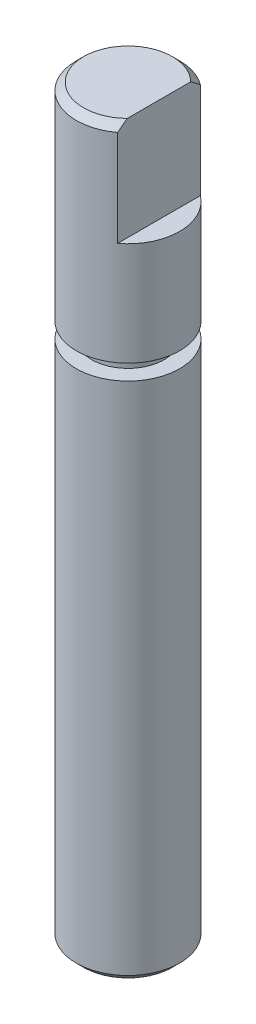
ISO-10303-21;
HEADER;
FILE_DESCRIPTION(('STEP AP214'),'2;1');
FILE_NAME('part.step','',(''),(''),'','','');
FILE_SCHEMA(('AUTOMOTIVE_DESIGN { 1 0 10303 214 1 1 1 1 }'));
ENDSEC;
DATA;
#1=APPLICATION_CONTEXT('core data for automotive mechanical design processes');
#2=APPLICATION_PROTOCOL_DEFINITION('international standard','automotive_design',2000,#1);
#3=PRODUCT_CONTEXT('',#1,'mechanical');
#4=PRODUCT('Part','Part','',(#3));
#5=PRODUCT_RELATED_PRODUCT_CATEGORY('part','',(#4));
#6=PRODUCT_DEFINITION_FORMATION('','',#4);
#7=PRODUCT_DEFINITION_CONTEXT('part definition',#1,'design');
#8=PRODUCT_DEFINITION('design','',#6,#7);
#9=PRODUCT_DEFINITION_SHAPE('','',#8);
#10=(LENGTH_UNIT() NAMED_UNIT(*) SI_UNIT(.MILLI.,.METRE.));
#11=(NAMED_UNIT(*) PLANE_ANGLE_UNIT() SI_UNIT($,.RADIAN.));
#12=(NAMED_UNIT(*) SI_UNIT($,.STERADIAN.) SOLID_ANGLE_UNIT());
#13=UNCERTAINTY_MEASURE_WITH_UNIT(LENGTH_MEASURE(1.E-05),#10,'distance_accuracy_value','');
#14=(GEOMETRIC_REPRESENTATION_CONTEXT(3) GLOBAL_UNCERTAINTY_ASSIGNED_CONTEXT((#13)) GLOBAL_UNIT_ASSIGNED_CONTEXT((#10,
#11,#12)) REPRESENTATION_CONTEXT('',''));
#15=CARTESIAN_POINT('',(0.,0.,0.));
#16=DIRECTION('',(0.,0.,1.));
#17=DIRECTION('',(1.,0.,0.));
#18=AXIS2_PLACEMENT_3D('',#15,#16,#17);
#19=CARTESIAN_POINT('',(0.,0.,0.));
#20=DIRECTION('',(0.,-1.,0.));
#21=DIRECTION('',(1.,0.,0.));
#22=AXIS2_PLACEMENT_3D('',#19,#20,#21);
#23=PLANE('',#22);
#24=CARTESIAN_POINT('',(0.,0.,0.));
#25=DIRECTION('',(0.,1.,0.));
#26=DIRECTION('',(-1.,0.,0.));
#27=AXIS2_PLACEMENT_3D('',#24,#25,#26);
#28=CIRCLE('',#27,4.29289321881344);
#29=CARTESIAN_POINT('',(-4.29289321881344,0.,0.));
#30=VERTEX_POINT('',#29);
#31=EDGE_CURVE('E106',#30,#30,#28,.T.);
#32=ORIENTED_EDGE('',*,*,#31,.F.);
#33=EDGE_LOOP('',(#32));
#34=FACE_BOUND('',#33,.T.);
#35=ADVANCED_FACE('F33',(#34),#23,.T.);
#36=CARTESIAN_POINT('',(0.,0.707106781186545,0.));
#37=DIRECTION('',(0.,1.,0.));
#38=DIRECTION('',(-1.,0.,0.));
#39=AXIS2_PLACEMENT_3D('',#36,#37,#38);
#40=CONICAL_SURFACE('',#39,4.99999999999999,0.785398163397451);
#41=ORIENTED_EDGE('',*,*,#31,.T.);
#42=EDGE_LOOP('',(#41));
#43=FACE_BOUND('',#42,.T.);
#44=CARTESIAN_POINT('',(0.,0.707106781186545,0.));
#45=DIRECTION('',(0.,1.,0.));
#46=DIRECTION('',(-1.,0.,0.));
#47=AXIS2_PLACEMENT_3D('',#44,#45,#46);
#48=CIRCLE('',#47,4.99999999999999);
#49=CARTESIAN_POINT('',(-4.99999999999999,0.707106781186545,0.));
#50=VERTEX_POINT('',#49);
#51=EDGE_CURVE('E103',#50,#50,#48,.T.);
#52=ORIENTED_EDGE('',*,*,#51,.F.);
#53=EDGE_LOOP('',(#52));
#54=FACE_BOUND('',#53,.T.);
#55=ADVANCED_FACE('F123',(#43,#54),#40,.T.);
#56=CARTESIAN_POINT('',(0.,72.,0.));
#57=DIRECTION('',(0.,1.,0.));
#58=DIRECTION('',(-1.,0.,0.));
#59=AXIS2_PLACEMENT_3D('',#56,#57,#58);
#60=CYLINDRICAL_SURFACE('',#59,4.99999999999999);
#61=ORIENTED_EDGE('',*,*,#51,.T.);
#62=EDGE_LOOP('',(#61));
#63=FACE_BOUND('',#62,.T.);
#64=CARTESIAN_POINT('',(0.,50.5,0.));
#65=DIRECTION('',(0.,1.,0.));
#66=DIRECTION('',(-1.,0.,0.));
#67=AXIS2_PLACEMENT_3D('',#64,#65,#66);
#68=CIRCLE('',#67,4.99999999999999);
#69=CARTESIAN_POINT('',(-4.99999999999999,50.5,0.));
#70=VERTEX_POINT('',#69);
#71=EDGE_CURVE('E100',#70,#70,#68,.T.);
#72=ORIENTED_EDGE('',*,*,#71,.F.);
#73=EDGE_LOOP('',(#72));
#74=FACE_BOUND('',#73,.T.);
#75=ADVANCED_FACE('F128',(#63,#74),#60,.T.);
#76=CARTESIAN_POINT('',(-4.99999999999999,50.5,0.));
#77=DIRECTION('',(0.,1.,0.));
#78=DIRECTION('',(-1.,0.,0.));
#79=AXIS2_PLACEMENT_3D('',#76,#77,#78);
#80=PLANE('',#79);
#81=ORIENTED_EDGE('',*,*,#71,.T.);
#82=EDGE_LOOP('',(#81));
#83=FACE_BOUND('',#82,.T.);
#84=CARTESIAN_POINT('',(0.,50.5,0.));
#85=DIRECTION('',(0.,1.,0.));
#86=DIRECTION('',(-1.,0.,0.));
#87=AXIS2_PLACEMENT_3D('',#84,#85,#86);
#88=CIRCLE('',#87,3.5);
#89=CARTESIAN_POINT('',(-3.5,50.5,0.));
#90=VERTEX_POINT('',#89);
#91=EDGE_CURVE('E97',#90,#90,#88,.T.);
#92=ORIENTED_EDGE('',*,*,#91,.F.);
#93=EDGE_LOOP('',(#92));
#94=FACE_BOUND('',#93,.T.);
#95=ADVANCED_FACE('F136',(#83,#94),#80,.T.);
#96=CARTESIAN_POINT('',(0.,72.,0.));
#97=DIRECTION('',(0.,1.,0.));
#98=DIRECTION('',(-1.,0.,0.));
#99=AXIS2_PLACEMENT_3D('',#96,#97,#98);
#100=CYLINDRICAL_SURFACE('',#99,3.5);
#101=ORIENTED_EDGE('',*,*,#91,.T.);
#102=EDGE_LOOP('',(#101));
#103=FACE_BOUND('',#102,.T.);
#104=CARTESIAN_POINT('',(0.,52.,0.));
#105=DIRECTION('',(0.,1.,0.));
#106=DIRECTION('',(-1.,0.,0.));
#107=AXIS2_PLACEMENT_3D('',#104,#105,#106);
#108=CIRCLE('',#107,3.5);
#109=CARTESIAN_POINT('',(-3.5,52.,0.));
#110=VERTEX_POINT('',#109);
#111=EDGE_CURVE('E94',#110,#110,#108,.T.);
#112=ORIENTED_EDGE('',*,*,#111,.F.);
#113=EDGE_LOOP('',(#112));
#114=FACE_BOUND('',#113,.T.);
#115=ADVANCED_FACE('F142',(#103,#114),#100,.T.);
#116=CARTESIAN_POINT('',(-3.5,52.,0.));
#117=DIRECTION('',(0.,-1.,0.));
#118=DIRECTION('',(1.,0.,0.));
#119=AXIS2_PLACEMENT_3D('',#116,#117,#118);
#120=PLANE('',#119);
#121=ORIENTED_EDGE('',*,*,#111,.T.);
#122=EDGE_LOOP('',(#121));
#123=FACE_BOUND('',#122,.T.);
#124=CARTESIAN_POINT('',(0.,52.,0.));
#125=DIRECTION('',(0.,1.,0.));
#126=DIRECTION('',(-1.,0.,0.));
#127=AXIS2_PLACEMENT_3D('',#124,#125,#126);
#128=CIRCLE('',#127,5.);
#129=CARTESIAN_POINT('',(-5.,52.,0.));
#130=VERTEX_POINT('',#129);
#131=EDGE_CURVE('E91',#130,#130,#128,.T.);
#132=ORIENTED_EDGE('',*,*,#131,.F.);
#133=EDGE_LOOP('',(#132));
#134=FACE_BOUND('',#133,.T.);
#135=ADVANCED_FACE('F148',(#123,#134),#120,.T.);
#136=CARTESIAN_POINT('',(0.,72.,0.));
#137=DIRECTION('',(0.,1.,0.));
#138=DIRECTION('',(-1.,0.,0.));
#139=AXIS2_PLACEMENT_3D('',#136,#137,#138);
#140=CYLINDRICAL_SURFACE('',#139,5.);
#141=DIRECTION('',(0.,1.,0.));
#142=VECTOR('',#141,1.);
#143=CARTESIAN_POINT('',(3.,72.,4.));
#144=LINE('',#143,#142);
#145=CARTESIAN_POINT('',(3.,71.2928932188134,4.));
#146=VERTEX_POINT('',#145);
#147=CARTESIAN_POINT('',(3.,62.,4.));
#148=VERTEX_POINT('',#147);
#149=EDGE_CURVE('E70',#146,#148,#144,.F.);
#150=ORIENTED_EDGE('',*,*,#149,.F.);
#151=CARTESIAN_POINT('',(0.,71.2928932188134,0.));
#152=DIRECTION('',(0.,1.,0.));
#153=DIRECTION('',(-1.,0.,0.));
#154=AXIS2_PLACEMENT_3D('',#151,#152,#153);
#155=CIRCLE('',#154,5.);
#156=CARTESIAN_POINT('',(3.,71.2928932188133,-4.00000000000048));
#157=VERTEX_POINT('',#156);
#158=EDGE_CURVE('E77',#157,#146,#155,.T.);
#159=ORIENTED_EDGE('',*,*,#158,.F.);
#160=DIRECTION('',(0.,1.,0.));
#161=VECTOR('',#160,1.);
#162=CARTESIAN_POINT('',(3.,72.,-4.));
#163=LINE('',#162,#161);
#164=CARTESIAN_POINT('',(3.,62.,-4.));
#165=VERTEX_POINT('',#164);
#166=EDGE_CURVE('E52',#165,#157,#163,.T.);
#167=ORIENTED_EDGE('',*,*,#166,.F.);
#168=CARTESIAN_POINT('',(0.,62.,0.));
#169=DIRECTION('',(0.,-1.,0.));
#170=DIRECTION('',(0.,0.,-1.));
#171=AXIS2_PLACEMENT_3D('',#168,#169,#170);
#172=CIRCLE('',#171,5.);
#173=EDGE_CURVE('E11',#148,#165,#172,.F.);
#174=ORIENTED_EDGE('',*,*,#173,.F.);
#175=EDGE_LOOP('',(#150,#159,#167,#174));
#176=FACE_BOUND('',#175,.T.);
#177=ORIENTED_EDGE('',*,*,#131,.T.);
#178=EDGE_LOOP('',(#177));
#179=FACE_BOUND('',#178,.T.);
#180=ADVANCED_FACE('F74',(#176,#179),#140,.T.);
#181=CARTESIAN_POINT('',(0.,72.,0.));
#182=DIRECTION('',(0.,-1.,0.));
#183=DIRECTION('',(1.,0.,0.));
#184=AXIS2_PLACEMENT_3D('',#181,#182,#183);
#185=CONICAL_SURFACE('',#184,4.29289321881345,0.785398163397447);
#186=CARTESIAN_POINT('',(3.,65.2777119220844,-10.5987838453196));
#187=CARTESIAN_POINT('',(3.,65.4847171292241,-10.3836363350216));
#188=CARTESIAN_POINT('',(3.,65.6914890960308,-10.16826377443));
#189=CARTESIAN_POINT('',(3.,66.104449316693,-9.73695616658823));
#190=CARTESIAN_POINT('',(3.,66.3106375652985,-9.52102111431211));
#191=CARTESIAN_POINT('',(3.,66.7223754088028,-9.08841063707692));
#192=CARTESIAN_POINT('',(3.,66.9279247776936,-8.87173499690014));
#193=CARTESIAN_POINT('',(3.,67.3381523167953,-8.43756165019662));
#194=CARTESIAN_POINT('',(3.,67.5428304902801,-8.22006394676504));
#195=CARTESIAN_POINT('',(3.,67.9496125925267,-7.78563464180021));
#196=CARTESIAN_POINT('',(3.,68.151724415531,-7.56871043736963));
#197=CARTESIAN_POINT('',(3.,68.5545824253167,-7.13359796181427));
#198=CARTESIAN_POINT('',(3.,68.7553286180107,-6.91540969617008));
#199=CARTESIAN_POINT('',(3.,69.1550205006556,-6.47744140064298));
#200=CARTESIAN_POINT('',(3.,69.3539664259327,-6.25766158576756));
#201=CARTESIAN_POINT('',(3.,69.7494963695441,-5.81598951040906));
#202=CARTESIAN_POINT('',(3.,69.9460804394266,-5.59409729621979));
#203=CARTESIAN_POINT('',(3.,70.2803210714746,-5.21124310364886));
#204=CARTESIAN_POINT('',(3.,70.4187738227823,-5.05097696357073));
#205=CARTESIAN_POINT('',(3.,70.6935516563668,-4.72860924295232));
#206=CARTESIAN_POINT('',(3.,70.8298766045437,-4.56650754783252));
#207=CARTESIAN_POINT('',(3.,71.1003492647415,-4.23922758861353));
#208=CARTESIAN_POINT('',(3.,71.234483992562,-4.07403856357002));
#209=CARTESIAN_POINT('',(3.,71.4989248872942,-3.74064911658809));
#210=CARTESIAN_POINT('',(3.,71.6292316392744,-3.57244916123187));
#211=CARTESIAN_POINT('',(3.,71.885560701163,-3.23070708924545));
#212=CARTESIAN_POINT('',(3.,72.0115408129431,-3.0571331746531));
#213=CARTESIAN_POINT('',(3.,72.2558738302779,-2.70440390004263));
#214=CARTESIAN_POINT('',(3.,72.3742206811446,-2.52524427253967));
#215=CARTESIAN_POINT('',(3.,72.542721793125,-2.25141805780404));
#216=CARTESIAN_POINT('',(3.,72.597291388093,-2.15947259698991));
#217=CARTESIAN_POINT('',(3.,72.7027972754644,-1.97349147970135));
#218=CARTESIAN_POINT('',(3.,72.7537331229736,-1.87945556912717));
#219=CARTESIAN_POINT('',(3.,72.8509920872202,-1.68918785469348));
#220=CARTESIAN_POINT('',(3.,72.8973219942633,-1.5929595483747));
#221=CARTESIAN_POINT('',(3.,72.9843082729721,-1.39797842469887));
#222=CARTESIAN_POINT('',(3.,73.0249661885845,-1.29922630303188));
#223=CARTESIAN_POINT('',(3.,73.0999829733125,-1.0971086871128));
#224=CARTESIAN_POINT('',(3.,73.1342022730545,-0.993690661785713));
#225=CARTESIAN_POINT('',(3.,73.1936930340098,-0.784286111894559));
#226=CARTESIAN_POINT('',(3.,73.2189659233115,-0.678300000154858));
#227=CARTESIAN_POINT('',(3.,73.2588454415152,-0.465098574662744));
#228=CARTESIAN_POINT('',(3.,73.2735284063933,-0.357897833332319));
#229=CARTESIAN_POINT('',(3.,73.291424691342,-0.14253608883637));
#230=CARTESIAN_POINT('',(3.,73.2946396290299,-0.0343752232585653));
#231=CARTESIAN_POINT('',(3.,73.2893318032583,0.18196748054922));
#232=CARTESIAN_POINT('',(3.,73.2807747597502,0.290148458910428));
#233=CARTESIAN_POINT('',(3.,73.2525473394672,0.505039930596122));
#234=CARTESIAN_POINT('',(3.,73.2328746424671,0.611750112148598));
#235=CARTESIAN_POINT('',(3.,73.1835915374582,0.823698718019103));
#236=CARTESIAN_POINT('',(3.,73.1539036130609,0.92891877811221));
#237=CARTESIAN_POINT('',(3.,73.0862914198325,1.13663932594968));
#238=CARTESIAN_POINT('',(3.,73.0483667128677,1.23913966870035));
#239=CARTESIAN_POINT('',(3.,72.9582699234644,1.4600278697862));
#240=CARTESIAN_POINT('',(3.,72.90476025269,1.57786492802453));
#241=CARTESIAN_POINT('',(3.,72.7905973732116,1.8100561479103));
#242=CARTESIAN_POINT('',(3.,72.7299401623929,1.9244083127329));
#243=CARTESIAN_POINT('',(3.,72.6030602889597,2.15025788044778));
#244=CARTESIAN_POINT('',(3.,72.5368267290129,2.26174911077095));
#245=CARTESIAN_POINT('',(3.,72.4001705113884,2.48208648780179));
#246=CARTESIAN_POINT('',(3.,72.3297486553757,2.59093313511656));
#247=CARTESIAN_POINT('',(3.,72.1848488567182,2.80759364186351));
#248=CARTESIAN_POINT('',(3.,72.1103352242027,2.91538352000373));
#249=CARTESIAN_POINT('',(3.,71.9586663577359,3.12908703402794));
#250=CARTESIAN_POINT('',(3.,71.8815110309154,3.23500060375085));
#251=CARTESIAN_POINT('',(3.,71.7251898205263,3.4451175071964));
#252=CARTESIAN_POINT('',(3.,71.6460266518265,3.5493228662253));
#253=CARTESIAN_POINT('',(3.,71.4859932886355,3.75640782850318));
#254=CARTESIAN_POINT('',(3.,71.4051231295108,3.85928745914843));
#255=CARTESIAN_POINT('',(3.,71.2028875477622,4.11297055467154));
#256=CARTESIAN_POINT('',(3.,71.0806902888489,4.26311040194954));
#257=CARTESIAN_POINT('',(3.,70.8339619863596,4.56146348647078));
#258=CARTESIAN_POINT('',(3.,70.7094308466384,4.70967664391544));
#259=CARTESIAN_POINT('',(3.,70.4585336273926,5.00457363043484));
#260=CARTESIAN_POINT('',(3.,70.3321673036096,5.15125725138496));
#261=CARTESIAN_POINT('',(3.,70.0779864621157,5.4433654866287));
#262=CARTESIAN_POINT('',(3.,69.9501719258135,5.58879008471744));
#263=CARTESIAN_POINT('',(3.,69.5647044060884,6.02384664530682));
#264=CARTESIAN_POINT('',(3.,69.3053085229567,6.31193380004846));
#265=CARTESIAN_POINT('',(3.,68.7834089013936,6.88522536365733));
#266=CARTESIAN_POINT('',(3.,68.5209054129358,7.17043000101682));
#267=CARTESIAN_POINT('',(3.,68.0115376166851,7.71949574331911));
#268=CARTESIAN_POINT('',(3.,67.7648197326652,7.98349283568409));
#269=CARTESIAN_POINT('',(3.,67.269918596681,8.51012076777205));
#270=CARTESIAN_POINT('',(3.,67.0217353085096,8.77275157343271));
#271=CARTESIAN_POINT('',(3.,66.5247396160464,9.29643166306556));
#272=CARTESIAN_POINT('',(3.,66.275929421404,9.55748304580601));
#273=CARTESIAN_POINT('',(3.,65.777427649748,10.0787247271842));
#274=CARTESIAN_POINT('',(3.,65.5277361055631,10.3389150572095));
#275=CARTESIAN_POINT('',(3.,65.2777119220844,10.5987838453196));
#276=B_SPLINE_CURVE_WITH_KNOTS('',3,(#186,#187,#188,#189,#190,#191,#192,#193,#194,#195,#196,
#197,#198,#199,#200,#201,#202,#203,#204,#205,#206,#207,#208,#209,#210,#211,#212,#213,#214,#215,
#216,#217,#218,#219,#220,#221,#222,#223,#224,#225,#226,#227,#228,#229,#230,#231,#232,#233,#234,
#235,#236,#237,#238,#239,#240,#241,#242,#243,#244,#245,#246,#247,#248,#249,#250,#251,#252,#253,
#254,#255,#256,#257,#258,#259,#260,#261,#262,#263,#264,#265,#266,#267,#268,#269,#270,#271,#272,
#273,#274,#275),.UNSPECIFIED.,.F.,.F.,(4,2,2,2,2,2,2,2,2,2,2,2,2,2,2,2,2,2,2,2,2,2,2,2,2,2,2,2,
2,2,2,2,2,2,2,2,2,2,2,2,2,2,2,2,4),(0.,0.895688214480088,1.79138445952445,2.68736793763295,
3.58334804561162,4.47280841856234,5.36226493796969,6.25160345980429,7.1409225362097,
7.77627436115246,8.41166606726172,9.0499961656628,9.68822818855727,10.3315242225438,
10.9753243970509,11.2960199927951,11.6167547854281,11.9370094959274,12.2571768605579,
12.5836393318065,12.9100496673175,13.2340829424641,13.5580705094408,13.8830035289711,
14.2080043984432,14.5355807507373,14.8631745318497,15.2511033097654,15.6392503417322,
16.0281743282654,16.4170241104999,16.8100885407505,17.2031668034874,17.5957392662351,
17.9883036033945,18.5690172837539,19.1497549396523,19.7305706117752,20.3113937484885,
21.4743346250504,22.6371825826308,23.7211851552222,24.8052146243493,25.8871037582575,
26.9689530102975),.UNSPECIFIED.);
#277=CARTESIAN_POINT('',(3.,72.,-3.07065663794155));
#278=VERTEX_POINT('',#277);
#279=EDGE_CURVE('E47',#157,#278,#276,.T.);
#280=ORIENTED_EDGE('',*,*,#279,.F.);
#281=ORIENTED_EDGE('',*,*,#158,.T.);
#282=CARTESIAN_POINT('',(3.,72.,3.07065663794155));
#283=VERTEX_POINT('',#282);
#284=EDGE_CURVE('E71',#283,#146,#276,.T.);
#285=ORIENTED_EDGE('',*,*,#284,.F.);
#286=CARTESIAN_POINT('',(0.,72.,0.));
#287=DIRECTION('',(0.,1.,0.));
#288=DIRECTION('',(-1.,0.,0.));
#289=AXIS2_PLACEMENT_3D('',#286,#287,#288);
#290=CIRCLE('',#289,4.29289321881345);
#291=EDGE_CURVE('E79',#278,#283,#290,.T.);
#292=ORIENTED_EDGE('',*,*,#291,.F.);
#293=EDGE_LOOP('',(#280,#281,#285,#292));
#294=FACE_BOUND('',#293,.T.);
#295=ADVANCED_FACE('F112',(#294),#185,.T.);
#296=CARTESIAN_POINT('',(-4.29289321881345,72.,0.));
#297=DIRECTION('',(0.,1.,0.));
#298=DIRECTION('',(-1.,0.,0.));
#299=AXIS2_PLACEMENT_3D('',#296,#297,#298);
#300=PLANE('',#299);
#301=DIRECTION('',(0.,0.,1.));
#302=VECTOR('',#301,1.);
#303=CARTESIAN_POINT('',(3.,72.,0.));
#304=LINE('',#303,#302);
#305=EDGE_CURVE('E40',#278,#283,#304,.T.);
#306=ORIENTED_EDGE('',*,*,#305,.F.);
#307=ORIENTED_EDGE('',*,*,#291,.T.);
#308=EDGE_LOOP('',(#306,#307));
#309=FACE_BOUND('',#308,.T.);
#310=ADVANCED_FACE('F113',(#309),#300,.T.);
#311=CARTESIAN_POINT('',(9.,62.,-5.));
#312=DIRECTION('',(0.,-1.,0.));
#313=DIRECTION('',(0.,0.,-1.));
#314=AXIS2_PLACEMENT_3D('',#311,#312,#313);
#315=PLANE('',#314);
#316=ORIENTED_EDGE('',*,*,#173,.T.);
#317=DIRECTION('',(0.,0.,1.));
#318=VECTOR('',#317,1.);
#319=CARTESIAN_POINT('',(3.,62.,-5.));
#320=LINE('',#319,#318);
#321=EDGE_CURVE('E66',#165,#148,#320,.T.);
#322=ORIENTED_EDGE('',*,*,#321,.T.);
#323=EDGE_LOOP('',(#316,#322));
#324=FACE_BOUND('',#323,.T.);
#325=ADVANCED_FACE('F65',(#324),#315,.F.);
#326=CARTESIAN_POINT('',(3.,76.,-5.));
#327=DIRECTION('',(-1.,0.,0.));
#328=DIRECTION('',(0.,-1.,0.));
#329=AXIS2_PLACEMENT_3D('',#326,#327,#328);
#330=PLANE('',#329);
#331=ORIENTED_EDGE('',*,*,#149,.T.);
#332=ORIENTED_EDGE('',*,*,#321,.F.);
#333=ORIENTED_EDGE('',*,*,#166,.T.);
#334=ORIENTED_EDGE('',*,*,#279,.T.);
#335=ORIENTED_EDGE('',*,*,#305,.T.);
#336=ORIENTED_EDGE('',*,*,#284,.T.);
#337=EDGE_LOOP('',(#331,#332,#333,#334,#335,#336));
#338=FACE_BOUND('',#337,.T.);
#339=ADVANCED_FACE('F69',(#338),#330,.F.);
#340=CLOSED_SHELL('',(#35,#55,#75,#95,#115,#135,#180,#295,#310,#325,#339));
#341=MANIFOLD_SOLID_BREP('B2',#340);
#342=ADVANCED_BREP_SHAPE_REPRESENTATION('',(#18,#341),#14);
#343=SHAPE_DEFINITION_REPRESENTATION(#9,#342);
ENDSEC;
END-ISO-10303-21;
